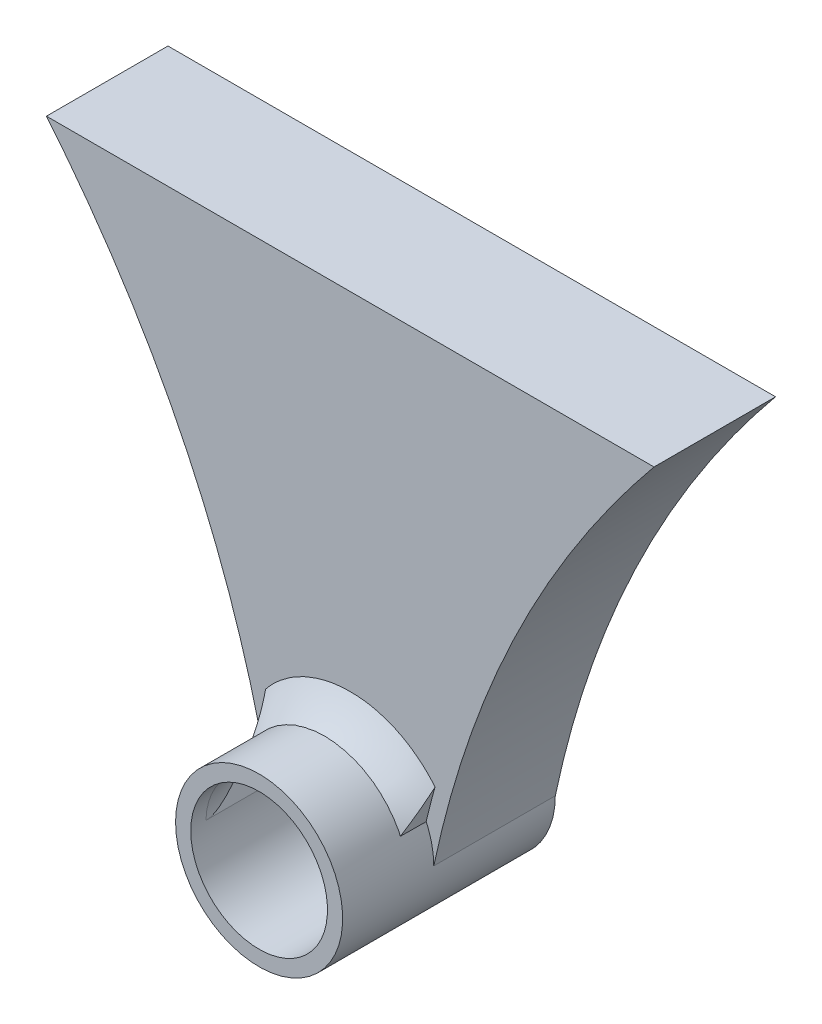
ISO-10303-21;
HEADER;
FILE_DESCRIPTION(('STEP AP214'),'2;1');
FILE_NAME('part.step','',(''),(''),'','','');
FILE_SCHEMA(('AUTOMOTIVE_DESIGN { 1 0 10303 214 1 1 1 1 }'));
ENDSEC;
DATA;
#1=APPLICATION_CONTEXT('core data for automotive mechanical design processes');
#2=APPLICATION_PROTOCOL_DEFINITION('international standard','automotive_design',2000,#1);
#3=PRODUCT_CONTEXT('',#1,'mechanical');
#4=PRODUCT('Part','Part','',(#3));
#5=PRODUCT_RELATED_PRODUCT_CATEGORY('part','',(#4));
#6=PRODUCT_DEFINITION_FORMATION('','',#4);
#7=PRODUCT_DEFINITION_CONTEXT('part definition',#1,'design');
#8=PRODUCT_DEFINITION('design','',#6,#7);
#9=PRODUCT_DEFINITION_SHAPE('','',#8);
#10=(LENGTH_UNIT() NAMED_UNIT(*) SI_UNIT(.MILLI.,.METRE.));
#11=(NAMED_UNIT(*) PLANE_ANGLE_UNIT() SI_UNIT($,.RADIAN.));
#12=(NAMED_UNIT(*) SI_UNIT($,.STERADIAN.) SOLID_ANGLE_UNIT());
#13=UNCERTAINTY_MEASURE_WITH_UNIT(LENGTH_MEASURE(1.E-05),#10,'distance_accuracy_value','');
#14=(GEOMETRIC_REPRESENTATION_CONTEXT(3) GLOBAL_UNCERTAINTY_ASSIGNED_CONTEXT((#13)) GLOBAL_UNIT_ASSIGNED_CONTEXT((#10,
#11,#12)) REPRESENTATION_CONTEXT('',''));
#15=CARTESIAN_POINT('',(0.,0.,0.));
#16=DIRECTION('',(0.,0.,1.));
#17=DIRECTION('',(1.,0.,0.));
#18=AXIS2_PLACEMENT_3D('',#15,#16,#17);
#19=CARTESIAN_POINT('',(0.,0.,0.));
#20=DIRECTION('',(0.,0.,1.));
#21=DIRECTION('',(1.,0.,0.));
#22=AXIS2_PLACEMENT_3D('',#19,#20,#21);
#23=PLANE('',#22);
#24=CARTESIAN_POINT('',(-27.5,0.,0.));
#25=CARTESIAN_POINT('',(-45.1521605662528,83.2146752013781,0.));
#26=CARTESIAN_POINT('',(-100.,150.,0.));
#27=B_SPLINE_CURVE_WITH_KNOTS('',2,(#24,#25,#26),.UNSPECIFIED.,.F.,.F.,(3,3),(0.,1.),.UNSPECIFIED.);
#28=CARTESIAN_POINT('',(-27.5,0.,0.));
#29=VERTEX_POINT('',#28);
#30=CARTESIAN_POINT('',(-100.,150.,0.));
#31=VERTEX_POINT('',#30);
#32=EDGE_CURVE('E294',#29,#31,#27,.T.);
#33=ORIENTED_EDGE('',*,*,#32,.T.);
#34=DIRECTION('',(1.,0.,0.));
#35=VECTOR('',#34,1.);
#36=CARTESIAN_POINT('',(0.,150.,0.));
#37=LINE('',#36,#35);
#38=CARTESIAN_POINT('',(100.,150.,0.));
#39=VERTEX_POINT('',#38);
#40=EDGE_CURVE('E154',#31,#39,#37,.T.);
#41=ORIENTED_EDGE('',*,*,#40,.T.);
#42=CARTESIAN_POINT('',(27.5,0.,0.));
#43=CARTESIAN_POINT('',(45.1521605662528,83.2146752013781,0.));
#44=CARTESIAN_POINT('',(100.,150.,0.));
#45=B_SPLINE_CURVE_WITH_KNOTS('',2,(#42,#43,#44),.UNSPECIFIED.,.F.,.F.,(3,3),(0.,1.),.UNSPECIFIED.);
#46=CARTESIAN_POINT('',(27.5,0.,0.));
#47=VERTEX_POINT('',#46);
#48=EDGE_CURVE('E284',#47,#39,#45,.T.);
#49=ORIENTED_EDGE('',*,*,#48,.F.);
#50=CARTESIAN_POINT('',(0.,0.,0.));
#51=DIRECTION('',(0.,0.,1.));
#52=DIRECTION('',(1.,0.,0.));
#53=AXIS2_PLACEMENT_3D('',#50,#51,#52);
#54=CIRCLE('',#53,27.5);
#55=EDGE_CURVE('E134',#29,#47,#54,.T.);
#56=ORIENTED_EDGE('',*,*,#55,.F.);
#57=EDGE_LOOP('',(#33,#41,#49,#56));
#58=FACE_BOUND('',#57,.T.);
#59=CARTESIAN_POINT('',(-22.4944780792199,0.49845355199398,0.));
#60=CARTESIAN_POINT('',(-22.5261649910723,0.647735568093537,0.));
#61=CARTESIAN_POINT('',(-22.5578084829011,0.797026858008572,0.));
#62=CARTESIAN_POINT('',(-22.6211542615998,1.09559702159194,0.));
#63=CARTESIAN_POINT('',(-22.6528565484953,1.24487589525485,0.));
#64=CARTESIAN_POINT('',(-22.7482699820461,1.69264710399708,0.));
#65=CARTESIAN_POINT('',(-22.812287732486,1.99107417391221,0.));
#66=CARTESIAN_POINT('',(-22.941045617088,2.58777257342693,0.));
#67=CARTESIAN_POINT('',(-23.0057857516789,2.88604390293397,0.));
#68=CARTESIAN_POINT('',(-23.1360145144982,3.48242312309974,0.));
#69=CARTESIAN_POINT('',(-23.2015031431676,3.78053101366205,0.));
#70=CARTESIAN_POINT('',(-23.5308047703964,5.27065922794665,0.));
#71=CARTESIAN_POINT('',(-23.8001948210256,6.46145319426544,0.));
#72=CARTESIAN_POINT('',(-24.3509328075913,8.84031195643326,0.));
#73=CARTESIAN_POINT('',(-24.6322811357418,10.0283766614174,0.));
#74=CARTESIAN_POINT('',(-25.2069607360962,12.4015996079948,0.));
#75=CARTESIAN_POINT('',(-25.5002920007143,13.5867578514275,0.));
#76=CARTESIAN_POINT('',(-26.3983181532512,17.1376888025768,0.));
#77=CARTESIAN_POINT('',(-27.0210480797167,19.4989293121634,0.));
#78=CARTESIAN_POINT('',(-28.3146535548065,24.2076504551079,0.));
#79=CARTESIAN_POINT('',(-28.9855192581997,26.5551337965829,0.));
#80=CARTESIAN_POINT('',(-30.3756314874624,31.2357190412979,0.));
#81=CARTESIAN_POINT('',(-31.0948776195382,33.5688210614262,0.));
#82=CARTESIAN_POINT('',(-32.5817934291057,38.2195446552595,0.));
#83=CARTESIAN_POINT('',(-33.34946311414,40.5371662265532,0.));
#84=CARTESIAN_POINT('',(-34.9334157397631,45.1565122395279,0.));
#85=CARTESIAN_POINT('',(-35.7497131097894,47.4582317341536,0.));
#86=CARTESIAN_POINT('',(-37.4305802597761,52.0439806405096,0.));
#87=CARTESIAN_POINT('',(-38.2951500838729,54.3280100360632,0.));
#88=CARTESIAN_POINT('',(-40.0723287613082,58.8772715684135,0.));
#89=CARTESIAN_POINT('',(-40.9849370281849,61.1425039342969,0.));
#90=CARTESIAN_POINT('',(-42.8580374444006,65.6534952965617,0.));
#91=CARTESIAN_POINT('',(-43.8185369907658,67.8992512214413,0.));
#92=CARTESIAN_POINT('',(-45.7869084961878,72.369943869366,0.));
#93=CARTESIAN_POINT('',(-46.7947810784447,74.5948803180655,0.));
#94=CARTESIAN_POINT('',(-48.8574505253708,79.0230147538254,0.));
#95=CARTESIAN_POINT('',(-49.9122496680692,81.2262116791932,0.));
#96=CARTESIAN_POINT('',(-52.328222600397,86.138576693915,0.));
#97=CARTESIAN_POINT('',(-53.7019234204557,88.8415948628368,0.));
#98=CARTESIAN_POINT('',(-56.5196053906015,94.2111016955475,0.));
#99=CARTESIAN_POINT('',(-57.9635941668755,96.8775863550787,0.));
#100=CARTESIAN_POINT('',(-60.9204523108314,102.172422027144,0.));
#101=CARTESIAN_POINT('',(-62.4333282689631,104.80076935922,0.));
#102=CARTESIAN_POINT('',(-65.5263688497674,110.017804830714,0.));
#103=CARTESIAN_POINT('',(-67.1065381008984,112.606490225464,0.));
#104=CARTESIAN_POINT('',(-70.3342412487987,117.745716866476,0.));
#105=CARTESIAN_POINT('',(-71.9818514908304,120.296210154372,0.));
#106=CARTESIAN_POINT('',(-75.3407971710139,125.35470561639,0.));
#107=CARTESIAN_POINT('',(-77.0521296771752,127.862709737816,0.));
#108=CARTESIAN_POINT('',(-80.5364341207133,132.835031062776,0.));
#109=CARTESIAN_POINT('',(-82.3093980884767,135.29935385301,0.));
#110=CARTESIAN_POINT('',(-85.914710930116,140.183264719251,0.));
#111=CARTESIAN_POINT('',(-87.7470454981084,142.602863354492,0.));
#112=CARTESIAN_POINT('',(-89.6082586524975,145.,0.));
#113=B_SPLINE_CURVE_WITH_KNOTS('',3,(#59,#60,#61,#62,#63,#64,#65,#66,#67,#68,#69,#70,#71,#72,
#73,#74,#75,#76,#77,#78,#79,#80,#81,#82,#83,#84,#85,#86,#87,#88,#89,#90,#91,#92,#93,#94,#95,#96,
#97,#98,#99,#100,#101,#102,#103,#104,#105,#106,#107,#108,#109,#110,#111,#112),.UNSPECIFIED.,.F.,
.F.,(4,2,2,2,2,2,2,2,2,2,2,2,2,2,2,2,2,2,2,2,2,2,2,2,2,2,4),(0.,0.457823908065395,
0.915648015457249,1.8312957793508,2.7469440868415,3.66259293397137,7.32518079229947,
10.9878888709575,14.6505946309336,21.9759704963478,29.2998523470201,36.6236745919939,
43.9474979777352,51.2735055144311,58.599519749545,65.9254445681241,73.2525044356426,
80.5796607188465,87.9071730845616,97.0022631156119,106.098342165854,115.195293275664,
124.292871091007,133.401049026709,142.508808393291,151.61539437759,160.719802131418),.UNSPECIFIED.);
#114=CARTESIAN_POINT('',(-22.4944780792199,0.49845355199398,0.));
#115=VERTEX_POINT('',#114);
#116=CARTESIAN_POINT('',(-89.6082586524975,145.,0.));
#117=VERTEX_POINT('',#116);
#118=EDGE_CURVE('E141',#115,#117,#113,.T.);
#119=ORIENTED_EDGE('',*,*,#118,.F.);
#120=CARTESIAN_POINT('',(0.,0.,0.));
#121=DIRECTION('',(0.,0.,1.));
#122=DIRECTION('',(1.,0.,0.));
#123=AXIS2_PLACEMENT_3D('',#120,#121,#122);
#124=CIRCLE('',#123,22.5);
#125=CARTESIAN_POINT('',(22.4944780792199,0.498453551993978,0.));
#126=VERTEX_POINT('',#125);
#127=EDGE_CURVE('E145',#115,#126,#124,.T.);
#128=ORIENTED_EDGE('',*,*,#127,.T.);
#129=CARTESIAN_POINT('',(22.4944780792199,0.498453551993978,0.));
#130=CARTESIAN_POINT('',(22.5261649910723,0.647735568093535,0.));
#131=CARTESIAN_POINT('',(22.5578084829011,0.79702685800857,0.));
#132=CARTESIAN_POINT('',(22.6211542615998,1.09559702159194,0.));
#133=CARTESIAN_POINT('',(22.6528565484953,1.24487589525484,0.));
#134=CARTESIAN_POINT('',(22.7482699820461,1.69264710399708,0.));
#135=CARTESIAN_POINT('',(22.812287732486,1.9910741739122,0.));
#136=CARTESIAN_POINT('',(22.941045617088,2.58777257342693,0.));
#137=CARTESIAN_POINT('',(23.0057857516789,2.88604390293396,0.));
#138=CARTESIAN_POINT('',(23.1360145144982,3.48242312309974,0.));
#139=CARTESIAN_POINT('',(23.2015031431676,3.78053101366205,0.));
#140=CARTESIAN_POINT('',(23.5308047703964,5.27065922794664,0.));
#141=CARTESIAN_POINT('',(23.8001948210256,6.46145319426543,0.));
#142=CARTESIAN_POINT('',(24.3509328075913,8.84031195643325,0.));
#143=CARTESIAN_POINT('',(24.6322811357418,10.0283766614174,0.));
#144=CARTESIAN_POINT('',(25.2069607360962,12.4015996079947,0.));
#145=CARTESIAN_POINT('',(25.5002920007143,13.5867578514275,0.));
#146=CARTESIAN_POINT('',(26.3983181532512,17.1376888025768,0.));
#147=CARTESIAN_POINT('',(27.0210480797167,19.4989293121634,0.));
#148=CARTESIAN_POINT('',(28.3146535548065,24.2076504551079,0.));
#149=CARTESIAN_POINT('',(28.9855192581997,26.5551337965829,0.));
#150=CARTESIAN_POINT('',(30.3756314874624,31.2357190412978,0.));
#151=CARTESIAN_POINT('',(31.0948776195381,33.5688210614262,0.));
#152=CARTESIAN_POINT('',(32.5817934291057,38.2195446552595,0.));
#153=CARTESIAN_POINT('',(33.3494631141399,40.5371662265532,0.));
#154=CARTESIAN_POINT('',(34.933415739763,45.1565122395278,0.));
#155=CARTESIAN_POINT('',(35.7497131097894,47.4582317341536,0.));
#156=CARTESIAN_POINT('',(37.4305802597761,52.0439806405095,0.));
#157=CARTESIAN_POINT('',(38.2951500838729,54.3280100360632,0.));
#158=CARTESIAN_POINT('',(40.0723287613081,58.8772715684135,0.));
#159=CARTESIAN_POINT('',(40.9849370281849,61.1425039342969,0.));
#160=CARTESIAN_POINT('',(42.8580374444006,65.6534952965617,0.));
#161=CARTESIAN_POINT('',(43.8185369907658,67.8992512214413,0.));
#162=CARTESIAN_POINT('',(45.7869084961877,72.369943869366,0.));
#163=CARTESIAN_POINT('',(46.7947810784446,74.5948803180655,0.));
#164=CARTESIAN_POINT('',(48.8574505253708,79.0230147538254,0.));
#165=CARTESIAN_POINT('',(49.9122496680692,81.2262116791932,0.));
#166=CARTESIAN_POINT('',(52.328222600397,86.138576693915,0.));
#167=CARTESIAN_POINT('',(53.7019234204556,88.8415948628367,0.));
#168=CARTESIAN_POINT('',(56.5196053906014,94.2111016955475,0.));
#169=CARTESIAN_POINT('',(57.9635941668755,96.8775863550786,0.));
#170=CARTESIAN_POINT('',(60.9204523108314,102.172422027144,0.));
#171=CARTESIAN_POINT('',(62.4333282689631,104.80076935922,0.));
#172=CARTESIAN_POINT('',(65.5263688497673,110.017804830714,0.));
#173=CARTESIAN_POINT('',(67.1065381008983,112.606490225464,0.));
#174=CARTESIAN_POINT('',(70.3342412487987,117.745716866476,0.));
#175=CARTESIAN_POINT('',(71.9818514908303,120.296210154372,0.));
#176=CARTESIAN_POINT('',(75.3407971710138,125.35470561639,0.));
#177=CARTESIAN_POINT('',(77.0521296771752,127.862709737816,0.));
#178=CARTESIAN_POINT('',(80.5364341207132,132.835031062776,0.));
#179=CARTESIAN_POINT('',(82.3093980884767,135.29935385301,0.));
#180=CARTESIAN_POINT('',(85.914710930116,140.183264719251,0.));
#181=CARTESIAN_POINT('',(87.7470454981084,142.602863354492,0.));
#182=CARTESIAN_POINT('',(89.6082586524975,145.,0.));
#183=B_SPLINE_CURVE_WITH_KNOTS('',3,(#129,#130,#131,#132,#133,#134,#135,#136,#137,#138,#139,
#140,#141,#142,#143,#144,#145,#146,#147,#148,#149,#150,#151,#152,#153,#154,#155,#156,#157,#158,
#159,#160,#161,#162,#163,#164,#165,#166,#167,#168,#169,#170,#171,#172,#173,#174,#175,#176,#177,
#178,#179,#180,#181,#182),.UNSPECIFIED.,.F.,.F.,(4,2,2,2,2,2,2,2,2,2,2,2,2,2,2,2,2,2,2,2,2,2,2,
2,2,2,4),(0.,0.457823908065394,0.915648015457248,1.83129577935079,2.7469440868415,
3.66259293397137,7.32518079229946,10.9878888709575,14.6505946309336,21.9759704963478,
29.2998523470201,36.6236745919939,43.9474979777352,51.2735055144311,58.599519749545,
65.9254445681241,73.2525044356425,80.5796607188465,87.9071730845615,97.0022631156118,
106.098342165854,115.195293275664,124.292871091007,133.401049026709,142.508808393291,
151.61539437759,160.719802131418),.UNSPECIFIED.);
#184=CARTESIAN_POINT('',(89.6082586524975,145.,0.));
#185=VERTEX_POINT('',#184);
#186=EDGE_CURVE('E202',#126,#185,#183,.T.);
#187=ORIENTED_EDGE('',*,*,#186,.T.);
#188=DIRECTION('',(1.,0.,0.));
#189=VECTOR('',#188,1.);
#190=CARTESIAN_POINT('',(0.,145.,0.));
#191=LINE('',#190,#189);
#192=EDGE_CURVE('E196',#117,#185,#191,.T.);
#193=ORIENTED_EDGE('',*,*,#192,.F.);
#194=EDGE_LOOP('',(#119,#128,#187,#193));
#195=FACE_BOUND('',#194,.T.);
#196=ADVANCED_FACE('F39',(#58,#195),#23,.F.);
#197=CARTESIAN_POINT('',(-27.1469567886749,-1.66429350402756,40.));
#198=CARTESIAN_POINT('',(-27.3234783943375,-0.832146752013781,40.));
#199=CARTESIAN_POINT('',(-27.5,0.,40.));
#200=CARTESIAN_POINT('',(-45.1521605662528,83.2146752013781,40.));
#201=CARTESIAN_POINT('',(-100.,150.,40.));
#202=B_SPLINE_CURVE_WITH_KNOTS('',2,(#197,#198,#199,#200,#201),.UNSPECIFIED.,.F.,.F.,(3,2,3),
(-0.01,0.,1.),.UNSPECIFIED.);
#203=DIRECTION('',(0.,0.,-1.));
#204=VECTOR('',#203,1.);
#205=SURFACE_OF_LINEAR_EXTRUSION('',#202,#204);
#206=ORIENTED_EDGE('',*,*,#32,.F.);
#207=DIRECTION('',(0.,0.,-1.));
#208=VECTOR('',#207,1.);
#209=CARTESIAN_POINT('',(-27.5,0.,40.));
#210=LINE('',#209,#208);
#211=CARTESIAN_POINT('',(-27.5,0.,40.));
#212=VERTEX_POINT('',#211);
#213=EDGE_CURVE('E136',#212,#29,#210,.T.);
#214=ORIENTED_EDGE('',*,*,#213,.F.);
#215=CARTESIAN_POINT('',(-100.,150.,40.));
#216=VERTEX_POINT('',#215);
#217=EDGE_CURVE('E126',#212,#216,#202,.T.);
#218=ORIENTED_EDGE('',*,*,#217,.T.);
#219=DIRECTION('',(0.,0.,-1.));
#220=VECTOR('',#219,1.);
#221=CARTESIAN_POINT('',(-100.,150.,40.));
#222=LINE('',#221,#220);
#223=EDGE_CURVE('E283',#216,#31,#222,.T.);
#224=ORIENTED_EDGE('',*,*,#223,.T.);
#225=EDGE_LOOP('',(#206,#214,#218,#224));
#226=FACE_BOUND('',#225,.T.);
#227=ADVANCED_FACE('F163',(#226),#205,.T.);
#228=CARTESIAN_POINT('',(0.,0.,40.));
#229=DIRECTION('',(0.,0.,-1.));
#230=DIRECTION('',(-1.,0.,0.));
#231=AXIS2_PLACEMENT_3D('',#228,#229,#230);
#232=CYLINDRICAL_SURFACE('',#231,27.5);
#233=ORIENTED_EDGE('',*,*,#55,.T.);
#234=DIRECTION('',(0.,0.,-1.));
#235=VECTOR('',#234,1.);
#236=CARTESIAN_POINT('',(27.5,0.,40.));
#237=LINE('',#236,#235);
#238=CARTESIAN_POINT('',(27.5,0.,40.));
#239=VERTEX_POINT('',#238);
#240=EDGE_CURVE('E118',#239,#47,#237,.T.);
#241=ORIENTED_EDGE('',*,*,#240,.F.);
#242=CARTESIAN_POINT('',(0.,0.,40.));
#243=DIRECTION('',(0.,0.,1.));
#244=DIRECTION('',(1.,0.,0.));
#245=AXIS2_PLACEMENT_3D('',#242,#243,#244);
#246=CIRCLE('',#245,27.5);
#247=EDGE_CURVE('E132',#239,#212,#246,.T.);
#248=ORIENTED_EDGE('',*,*,#247,.T.);
#249=ORIENTED_EDGE('',*,*,#213,.T.);
#250=EDGE_LOOP('',(#233,#241,#248,#249));
#251=FACE_BOUND('',#250,.T.);
#252=CARTESIAN_POINT('',(0.,0.,70.));
#253=DIRECTION('',(0.,0.,-1.));
#254=DIRECTION('',(-1.,0.,0.));
#255=AXIS2_PLACEMENT_3D('',#252,#253,#254);
#256=CIRCLE('',#255,27.5);
#257=CARTESIAN_POINT('',(-27.5,0.,70.));
#258=VERTEX_POINT('',#257);
#259=EDGE_CURVE('E142',#258,#258,#256,.T.);
#260=ORIENTED_EDGE('',*,*,#259,.T.);
#261=EDGE_LOOP('',(#260));
#262=FACE_BOUND('',#261,.T.);
#263=ADVANCED_FACE('F130',(#251,#262),#232,.T.);
#264=CARTESIAN_POINT('',(27.1469567886749,-1.66429350402756,40.));
#265=CARTESIAN_POINT('',(27.3234783943375,-0.832146752013781,40.));
#266=CARTESIAN_POINT('',(27.5,0.,40.));
#267=CARTESIAN_POINT('',(45.1521605662528,83.2146752013781,40.));
#268=CARTESIAN_POINT('',(100.,150.,40.));
#269=B_SPLINE_CURVE_WITH_KNOTS('',2,(#264,#265,#266,#267,#268),.UNSPECIFIED.,.F.,.F.,(3,2,3),
(-0.01,0.,1.),.UNSPECIFIED.);
#270=DIRECTION('',(0.,0.,-1.));
#271=VECTOR('',#270,1.);
#272=SURFACE_OF_LINEAR_EXTRUSION('',#269,#271);
#273=ORIENTED_EDGE('',*,*,#48,.T.);
#274=DIRECTION('',(0.,0.,-1.));
#275=VECTOR('',#274,1.);
#276=CARTESIAN_POINT('',(100.,150.,40.));
#277=LINE('',#276,#275);
#278=CARTESIAN_POINT('',(100.,150.,40.));
#279=VERTEX_POINT('',#278);
#280=EDGE_CURVE('E120',#279,#39,#277,.T.);
#281=ORIENTED_EDGE('',*,*,#280,.F.);
#282=EDGE_CURVE('E114',#239,#279,#269,.T.);
#283=ORIENTED_EDGE('',*,*,#282,.F.);
#284=ORIENTED_EDGE('',*,*,#240,.T.);
#285=EDGE_LOOP('',(#273,#281,#283,#284));
#286=FACE_BOUND('',#285,.T.);
#287=ADVANCED_FACE('F117',(#286),#272,.F.);
#288=CARTESIAN_POINT('',(0.,150.,40.));
#289=DIRECTION('',(0.,1.,0.));
#290=DIRECTION('',(0.,0.,1.));
#291=AXIS2_PLACEMENT_3D('',#288,#289,#290);
#292=PLANE('',#291);
#293=ORIENTED_EDGE('',*,*,#40,.F.);
#294=ORIENTED_EDGE('',*,*,#223,.F.);
#295=DIRECTION('',(1.,0.,0.));
#296=VECTOR('',#295,1.);
#297=CARTESIAN_POINT('',(0.,150.,40.));
#298=LINE('',#297,#296);
#299=EDGE_CURVE('E125',#216,#279,#298,.T.);
#300=ORIENTED_EDGE('',*,*,#299,.T.);
#301=ORIENTED_EDGE('',*,*,#280,.T.);
#302=EDGE_LOOP('',(#293,#294,#300,#301));
#303=FACE_BOUND('',#302,.T.);
#304=ADVANCED_FACE('F267',(#303),#292,.T.);
#305=CARTESIAN_POINT('',(0.,0.,40.));
#306=DIRECTION('',(0.,0.,1.));
#307=DIRECTION('',(1.,0.,0.));
#308=AXIS2_PLACEMENT_3D('',#305,#306,#307);
#309=PLANE('',#308);
#310=ORIENTED_EDGE('',*,*,#247,.F.);
#311=ORIENTED_EDGE('',*,*,#282,.T.);
#312=ORIENTED_EDGE('',*,*,#299,.F.);
#313=ORIENTED_EDGE('',*,*,#217,.F.);
#314=EDGE_LOOP('',(#310,#311,#312,#313));
#315=FACE_BOUND('',#314,.T.);
#316=ADVANCED_FACE('F139',(#315),#309,.T.);
#317=CARTESIAN_POINT('',(-27.1469567886749,-1.66429350402756,40.));
#318=CARTESIAN_POINT('',(-27.3234783943375,-0.832146752013781,40.));
#319=CARTESIAN_POINT('',(-45.1521605662528,83.2146752013781,40.));
#320=CARTESIAN_POINT('',(-100.,150.,40.));
#321=B_SPLINE_CURVE_WITH_KNOTS('',2,(#317,#318,#319,#320),.UNSPECIFIED.,.F.,.F.,(3,1,3),(-0.01,
0.,1.),.UNSPECIFIED.);
#322=DIRECTION('',(0.,0.,-1.));
#323=VECTOR('',#322,1.);
#324=SURFACE_OF_LINEAR_EXTRUSION('',#321,#323);
#325=OFFSET_SURFACE('',#324,-5.,.F.);
#326=ORIENTED_EDGE('',*,*,#118,.T.);
#327=DIRECTION('',(0.,0.,-1.));
#328=VECTOR('',#327,1.);
#329=CARTESIAN_POINT('',(-89.6082586524975,145.,35.));
#330=LINE('',#329,#328);
#331=CARTESIAN_POINT('',(-89.6082586524975,145.,35.));
#332=VERTEX_POINT('',#331);
#333=EDGE_CURVE('E226',#332,#117,#330,.T.);
#334=ORIENTED_EDGE('',*,*,#333,.F.);
#335=CARTESIAN_POINT('',(-22.4944780792199,0.49845355199398,35.));
#336=CARTESIAN_POINT('',(-22.5261649910723,0.647735568093537,35.));
#337=CARTESIAN_POINT('',(-22.5578084829011,0.797026858008572,35.));
#338=CARTESIAN_POINT('',(-22.6211542615998,1.09559702159194,35.));
#339=CARTESIAN_POINT('',(-22.6528565484953,1.24487589525485,35.));
#340=CARTESIAN_POINT('',(-22.7482699820461,1.69264710399708,35.));
#341=CARTESIAN_POINT('',(-22.812287732486,1.99107417391221,35.));
#342=CARTESIAN_POINT('',(-22.941045617088,2.58777257342693,35.));
#343=CARTESIAN_POINT('',(-23.0057857516789,2.88604390293397,35.));
#344=CARTESIAN_POINT('',(-23.1360145144982,3.48242312309974,35.));
#345=CARTESIAN_POINT('',(-23.2015031431676,3.78053101366205,35.));
#346=CARTESIAN_POINT('',(-23.5308047703964,5.27065922794665,35.));
#347=CARTESIAN_POINT('',(-23.8001948210256,6.46145319426544,35.));
#348=CARTESIAN_POINT('',(-24.3509328075913,8.84031195643326,35.));
#349=CARTESIAN_POINT('',(-24.6322811357418,10.0283766614174,35.));
#350=CARTESIAN_POINT('',(-25.2069607360962,12.4015996079948,35.));
#351=CARTESIAN_POINT('',(-25.5002920007143,13.5867578514275,35.));
#352=CARTESIAN_POINT('',(-26.3983181532512,17.1376888025768,35.));
#353=CARTESIAN_POINT('',(-27.0210480797167,19.4989293121634,35.));
#354=CARTESIAN_POINT('',(-28.3146535548065,24.2076504551079,35.));
#355=CARTESIAN_POINT('',(-28.9855192581997,26.5551337965829,35.));
#356=CARTESIAN_POINT('',(-30.3756314874624,31.2357190412979,35.));
#357=CARTESIAN_POINT('',(-31.0948776195382,33.5688210614262,35.));
#358=CARTESIAN_POINT('',(-32.5817934291057,38.2195446552595,35.));
#359=CARTESIAN_POINT('',(-33.34946311414,40.5371662265532,35.));
#360=CARTESIAN_POINT('',(-34.9334157397631,45.1565122395279,35.));
#361=CARTESIAN_POINT('',(-35.7497131097894,47.4582317341536,35.));
#362=CARTESIAN_POINT('',(-37.4305802597761,52.0439806405096,35.));
#363=CARTESIAN_POINT('',(-38.2951500838729,54.3280100360632,35.));
#364=CARTESIAN_POINT('',(-40.0723287613082,58.8772715684135,35.));
#365=CARTESIAN_POINT('',(-40.9849370281849,61.1425039342969,35.));
#366=CARTESIAN_POINT('',(-42.8580374444006,65.6534952965617,35.));
#367=CARTESIAN_POINT('',(-43.8185369907658,67.8992512214413,35.));
#368=CARTESIAN_POINT('',(-45.7869084961878,72.369943869366,35.));
#369=CARTESIAN_POINT('',(-46.7947810784447,74.5948803180655,35.));
#370=CARTESIAN_POINT('',(-48.8574505253708,79.0230147538254,35.));
#371=CARTESIAN_POINT('',(-49.9122496680692,81.2262116791932,35.));
#372=CARTESIAN_POINT('',(-52.328222600397,86.138576693915,35.));
#373=CARTESIAN_POINT('',(-53.7019234204557,88.8415948628368,35.));
#374=CARTESIAN_POINT('',(-56.5196053906015,94.2111016955475,35.));
#375=CARTESIAN_POINT('',(-57.9635941668755,96.8775863550787,35.));
#376=CARTESIAN_POINT('',(-60.9204523108314,102.172422027144,35.));
#377=CARTESIAN_POINT('',(-62.4333282689631,104.80076935922,35.));
#378=CARTESIAN_POINT('',(-65.5263688497674,110.017804830714,35.));
#379=CARTESIAN_POINT('',(-67.1065381008984,112.606490225464,35.));
#380=CARTESIAN_POINT('',(-70.3342412487987,117.745716866476,35.));
#381=CARTESIAN_POINT('',(-71.9818514908304,120.296210154372,35.));
#382=CARTESIAN_POINT('',(-75.3407971710139,125.35470561639,35.));
#383=CARTESIAN_POINT('',(-77.0521296771752,127.862709737816,35.));
#384=CARTESIAN_POINT('',(-80.5364341207133,132.835031062776,35.));
#385=CARTESIAN_POINT('',(-82.3093980884767,135.29935385301,35.));
#386=CARTESIAN_POINT('',(-85.914710930116,140.183264719251,35.));
#387=CARTESIAN_POINT('',(-87.7470454981084,142.602863354492,35.));
#388=CARTESIAN_POINT('',(-89.6082586524975,145.,35.));
#389=B_SPLINE_CURVE_WITH_KNOTS('',3,(#335,#336,#337,#338,#339,#340,#341,#342,#343,#344,#345,
#346,#347,#348,#349,#350,#351,#352,#353,#354,#355,#356,#357,#358,#359,#360,#361,#362,#363,#364,
#365,#366,#367,#368,#369,#370,#371,#372,#373,#374,#375,#376,#377,#378,#379,#380,#381,#382,#383,
#384,#385,#386,#387,#388),.UNSPECIFIED.,.F.,.F.,(4,2,2,2,2,2,2,2,2,2,2,2,2,2,2,2,2,2,2,2,2,2,2,
2,2,2,4),(0.,0.457823908065395,0.915648015457249,1.8312957793508,2.7469440868415,
3.66259293397137,7.32518079229947,10.9878888709575,14.6505946309336,21.9759704963478,
29.2998523470201,36.6236745919939,43.9474979777352,51.2735055144311,58.599519749545,
65.9254445681241,73.2525044356426,80.5796607188465,87.9071730845616,97.0022631156119,
106.098342165854,115.195293275664,124.292871091007,133.401049026709,142.508808393291,
151.61539437759,160.719802131418),.UNSPECIFIED.);
#390=CARTESIAN_POINT('',(-33.3591010922747,40.5391215286591,35.));
#391=VERTEX_POINT('',#390);
#392=EDGE_CURVE('E182',#391,#332,#389,.T.);
#393=ORIENTED_EDGE('',*,*,#392,.F.);
#394=CARTESIAN_POINT('',(-33.3591010922747,40.5391215286591,35.));
#395=CARTESIAN_POINT('',(-33.2396863522467,40.1828038016042,34.999999228548));
#396=CARTESIAN_POINT('',(-33.120855722529,39.8263224906805,35.0061611829986));
#397=CARTESIAN_POINT('',(-32.8844688573813,39.1133699155875,35.0306395846948));
#398=CARTESIAN_POINT('',(-32.7669125700805,38.756898651603,35.048955535322));
#399=CARTESIAN_POINT('',(-32.4166432098861,37.6890086749979,35.121807324912));
#400=CARTESIAN_POINT('',(-32.185978279367,36.9780652324389,35.1942481538338));
#401=CARTESIAN_POINT('',(-31.7310852486079,35.5607423609773,35.38522615853));
#402=CARTESIAN_POINT('',(-31.5068545350462,34.8543611720601,35.5037443266071));
#403=CARTESIAN_POINT('',(-31.0680844229734,33.4570153895682,35.7832519901115));
#404=CARTESIAN_POINT('',(-30.8534592437598,32.7659682875556,35.9436956698808));
#405=CARTESIAN_POINT('',(-30.4313924487371,31.3923100741296,36.3057811573912));
#406=CARTESIAN_POINT('',(-30.223953068774,30.7097016301278,36.5074356554978));
#407=CARTESIAN_POINT('',(-29.8166375207765,29.3549003651842,36.9498140306834));
#408=CARTESIAN_POINT('',(-29.6167624205155,28.6827090225695,37.1905433983894));
#409=CARTESIAN_POINT('',(-29.1870394703883,27.2219791770651,37.7588043665729));
#410=CARTESIAN_POINT('',(-28.9588377028955,26.4359806797616,38.0941237078554));
#411=CARTESIAN_POINT('',(-28.513681823516,24.88324016465,38.813355227498));
#412=CARTESIAN_POINT('',(-28.2967290523235,24.1165004477587,39.1972731793288));
#413=CARTESIAN_POINT('',(-27.8740446729054,22.6038981769031,40.0098284091614));
#414=CARTESIAN_POINT('',(-27.6683137979525,21.8580369887516,40.4384686041322));
#415=CARTESIAN_POINT('',(-27.2668531676713,20.3845109078282,41.3389752132168));
#416=CARTESIAN_POINT('',(-27.0711812626294,19.6569614058097,41.8110557115608));
#417=CARTESIAN_POINT('',(-26.6907005901267,18.2248709426944,42.7927288528061));
#418=CARTESIAN_POINT('',(-26.5058906942848,17.5203275950343,43.3023175867975));
#419=CARTESIAN_POINT('',(-26.14672349976,16.134542404232,44.3554517695092));
#420=CARTESIAN_POINT('',(-25.9723646654594,15.4532971441535,44.89899220548));
#421=CARTESIAN_POINT('',(-25.6747592961552,14.2767072452165,45.8810557558512));
#422=CARTESIAN_POINT('',(-25.5493845157971,13.776399754075,46.3130199394589));
#423=CARTESIAN_POINT('',(-25.3041396187651,12.7890417227135,47.1933212188976));
#424=CARTESIAN_POINT('',(-25.1842693377941,12.3019907869914,47.6416578253298));
#425=CARTESIAN_POINT('',(-24.9498065790466,11.3409802484941,48.5537098292009));
#426=CARTESIAN_POINT('',(-24.8352154118313,10.86702390807,49.0174289967997));
#427=CARTESIAN_POINT('',(-24.6111246193954,9.93216771171745,49.9594334761108));
#428=CARTESIAN_POINT('',(-24.5016271434401,9.47127339875022,50.4377247981247));
#429=CARTESIAN_POINT('',(-24.2879229411555,8.56411689022422,51.406857066622));
#430=CARTESIAN_POINT('',(-24.1837038180471,8.11782137389236,51.8976641080097));
#431=CARTESIAN_POINT('',(-23.9802517151141,7.23934266046894,52.8926604637451));
#432=CARTESIAN_POINT('',(-23.8810180378038,6.80715749225691,53.39684789095));
#433=CARTESIAN_POINT('',(-23.7360353330465,6.17060369598705,54.1633620284654));
#434=CARTESIAN_POINT('',(-23.6883627300579,5.96041923547201,54.420513010742));
#435=CARTESIAN_POINT('',(-23.5943439826538,5.54422745198776,54.9384096237403));
#436=CARTESIAN_POINT('',(-23.5479978090125,5.33822003701276,55.199155175073));
#437=CARTESIAN_POINT('',(-23.4567215868212,4.93089063109172,55.7243257096206));
#438=CARTESIAN_POINT('',(-23.4117908768065,4.72956646346403,55.9887488883862));
#439=CARTESIAN_POINT('',(-23.323428812593,4.33209748936364,56.5216973646238));
#440=CARTESIAN_POINT('',(-23.279997392674,4.13595245595679,56.7902224815445));
#441=CARTESIAN_POINT('',(-23.2036403150696,3.78980165373759,57.2755726218964));
#442=CARTESIAN_POINT('',(-23.1704064646116,3.63867550560402,57.4915497593419));
#443=CARTESIAN_POINT('',(-23.105088600275,3.34077912450292,57.9266649182934));
#444=CARTESIAN_POINT('',(-23.0730045826702,3.19400887741909,58.1458029295526));
#445=CARTESIAN_POINT('',(-23.0101292030383,2.90556198895967,58.5876690419815));
#446=CARTESIAN_POINT('',(-22.9793381334939,2.76388650111841,58.8103979398567));
#447=CARTESIAN_POINT('',(-22.9192370887804,2.48659244015513,59.2600581278988));
#448=CARTESIAN_POINT('',(-22.8899283323979,2.35097886156302,59.4869926731061));
#449=CARTESIAN_POINT('',(-22.8331044535569,2.08736701828562,59.9454405811132));
#450=CARTESIAN_POINT('',(-22.8055890714464,1.95936765141923,60.1769532747153));
#451=CARTESIAN_POINT('',(-22.7527399502191,1.71292087453947,60.6452074373865));
#452=CARTESIAN_POINT('',(-22.7274056035998,1.59447080526643,60.881947427217));
#453=CARTESIAN_POINT('',(-22.6804242909378,1.37433496821682,61.3515452588956));
#454=CARTESIAN_POINT('',(-22.6586683449323,1.27215929548079,61.5841605731754));
#455=CARTESIAN_POINT('',(-22.6182437662282,1.08194530435871,62.0554862779053));
#456=CARTESIAN_POINT('',(-22.5995756129582,0.993909181423006,62.2941976082288));
#457=CARTESIAN_POINT('',(-22.5661746983595,0.836429564323437,62.7765491312255));
#458=CARTESIAN_POINT('',(-22.5514204294693,0.766884453323998,63.0201541244192));
#459=CARTESIAN_POINT('',(-22.5265814284976,0.649796133148728,63.5127346163833));
#460=CARTESIAN_POINT('',(-22.5164923749295,0.602232562034629,63.7617049204538));
#461=CARTESIAN_POINT('',(-22.5042997281922,0.544753719323277,64.1757141884701));
#462=CARTESIAN_POINT('',(-22.5006378198947,0.527491320260404,64.3396968185317));
#463=CARTESIAN_POINT('',(-22.4969529704633,0.510120566287745,64.5865904720534));
#464=CARTESIAN_POINT('',(-22.4960259922168,0.505750644389368,64.6692007602657));
#465=CARTESIAN_POINT('',(-22.4947880707989,0.499914873346809,64.8345388043466));
#466=CARTESIAN_POINT('',(-22.4944772060901,0.498449394085718,64.9172665738343));
#467=CARTESIAN_POINT('',(-22.4944780792199,0.498453551993906,65.));
#468=B_SPLINE_CURVE_WITH_KNOTS('',3,(#394,#395,#396,#397,#398,#399,#400,#401,#402,#403,#404,
#405,#406,#407,#408,#409,#410,#411,#412,#413,#414,#415,#416,#417,#418,#419,#420,#421,#422,#423,
#424,#425,#426,#427,#428,#429,#430,#431,#432,#433,#434,#435,#436,#437,#438,#439,#440,#441,#442,
#443,#444,#445,#446,#447,#448,#449,#450,#451,#452,#453,#454,#455,#456,#457,#458,#459,#460,#461,
#462,#463,#464,#465,#466,#467),.UNSPECIFIED.,.F.,.F.,(4,2,2,2,2,2,2,2,2,2,2,2,2,2,2,2,2,2,2,2,2,
2,2,2,2,2,2,2,2,2,2,2,2,2,2,2,4),(0.,1.12727734852788,2.25450863876827,4.50565994344865,
6.75588359303597,8.97815750348548,11.2011167698402,13.4243886673907,16.0760761378663,
18.7280789225641,21.3802547900712,24.0462834427644,26.7120346483644,29.377393199061,
31.395360801429,33.4132681326887,35.4316737474091,37.4509234366376,39.4651869987984,
41.4791679674162,42.4857039203236,43.4922176786069,44.4982538840967,45.5042459346972,
46.3012596113749,47.0982707048614,47.8954611324549,48.6932967105533,49.4910165169949,
50.2885134039107,51.0531217868896,51.8178487762108,52.5782820473052,53.3380094950167,
53.8323931684758,54.0805374322616,54.3287132953877),.UNSPECIFIED.);
#469=CARTESIAN_POINT('',(-22.4944780792199,0.49845355199398,65.));
#470=VERTEX_POINT('',#469);
#471=EDGE_CURVE('E53',#391,#470,#468,.T.);
#472=ORIENTED_EDGE('',*,*,#471,.T.);
#473=DIRECTION('',(0.,0.,-1.));
#474=VECTOR('',#473,1.);
#475=CARTESIAN_POINT('',(-22.4944780792199,0.49845355199398,35.));
#476=LINE('',#475,#474);
#477=EDGE_CURVE('E60',#470,#115,#476,.T.);
#478=ORIENTED_EDGE('',*,*,#477,.T.);
#479=EDGE_LOOP('',(#326,#334,#393,#472,#478));
#480=FACE_BOUND('',#479,.T.);
#481=ADVANCED_FACE('F171',(#480),#325,.F.);
#482=CARTESIAN_POINT('',(0.,0.,40.));
#483=DIRECTION('',(0.,0.,-1.));
#484=DIRECTION('',(-1.,0.,0.));
#485=AXIS2_PLACEMENT_3D('',#482,#483,#484);
#486=CYLINDRICAL_SURFACE('',#485,22.5);
#487=ORIENTED_EDGE('',*,*,#477,.F.);
#488=CARTESIAN_POINT('',(0.,0.,65.));
#489=DIRECTION('',(0.,0.,1.));
#490=DIRECTION('',(1.,0.,0.));
#491=AXIS2_PLACEMENT_3D('',#488,#489,#490);
#492=CIRCLE('',#491,22.5);
#493=CARTESIAN_POINT('',(22.4944780792199,0.498453551993978,65.));
#494=VERTEX_POINT('',#493);
#495=EDGE_CURVE('E242',#470,#494,#492,.F.);
#496=ORIENTED_EDGE('',*,*,#495,.T.);
#497=DIRECTION('',(0.,0.,-1.));
#498=VECTOR('',#497,1.);
#499=CARTESIAN_POINT('',(22.4944780792199,0.498453551993978,35.));
#500=LINE('',#499,#498);
#501=EDGE_CURVE('E67',#494,#126,#500,.T.);
#502=ORIENTED_EDGE('',*,*,#501,.T.);
#503=ORIENTED_EDGE('',*,*,#127,.F.);
#504=EDGE_LOOP('',(#487,#496,#502,#503));
#505=FACE_BOUND('',#504,.T.);
#506=CARTESIAN_POINT('',(0.,0.,70.));
#507=DIRECTION('',(0.,0.,-1.));
#508=DIRECTION('',(-1.,0.,0.));
#509=AXIS2_PLACEMENT_3D('',#506,#507,#508);
#510=CIRCLE('',#509,22.5);
#511=CARTESIAN_POINT('',(-22.5,0.,70.));
#512=VERTEX_POINT('',#511);
#513=EDGE_CURVE('E148',#512,#512,#510,.T.);
#514=ORIENTED_EDGE('',*,*,#513,.F.);
#515=EDGE_LOOP('',(#514));
#516=FACE_BOUND('',#515,.T.);
#517=ADVANCED_FACE('F175',(#505,#516),#486,.F.);
#518=CARTESIAN_POINT('',(27.1469567886749,-1.66429350402756,40.));
#519=CARTESIAN_POINT('',(27.3234783943375,-0.832146752013781,40.));
#520=CARTESIAN_POINT('',(45.1521605662528,83.2146752013781,40.));
#521=CARTESIAN_POINT('',(100.,150.,40.));
#522=B_SPLINE_CURVE_WITH_KNOTS('',2,(#518,#519,#520,#521),.UNSPECIFIED.,.F.,.F.,(3,1,3),(-0.01,
0.,1.),.UNSPECIFIED.);
#523=DIRECTION('',(0.,0.,-1.));
#524=VECTOR('',#523,1.);
#525=SURFACE_OF_LINEAR_EXTRUSION('',#522,#524);
#526=OFFSET_SURFACE('',#525,5.,.F.);
#527=ORIENTED_EDGE('',*,*,#186,.F.);
#528=ORIENTED_EDGE('',*,*,#501,.F.);
#529=CARTESIAN_POINT('',(22.4944780792199,0.498453551993978,65.));
#530=CARTESIAN_POINT('',(22.4944726452377,0.49842792852742,64.874826643421));
#531=CARTESIAN_POINT('',(22.4951874191959,0.50179747323007,64.7496625493972));
#532=CARTESIAN_POINT('',(22.498012291753,0.515114311896013,64.5001446115774));
#533=CARTESIAN_POINT('',(22.5001174295386,0.525038219914233,64.3757894686844));
#534=CARTESIAN_POINT('',(22.5056732682207,0.551229182015979,64.128020430713));
#535=CARTESIAN_POINT('',(22.5091214372454,0.567484300552268,64.0046052074408));
#536=CARTESIAN_POINT('',(22.5172894281333,0.605989363702693,63.7588281246471));
#537=CARTESIAN_POINT('',(22.5220085792277,0.628236146179254,63.6364657445324));
#538=CARTESIAN_POINT('',(22.5325240407652,0.677807279147061,63.3954327342464));
#539=CARTESIAN_POINT('',(22.5382964149859,0.705018797281063,63.2767377129114));
#540=CARTESIAN_POINT('',(22.5508914064466,0.764393938702034,63.0405753981216));
#541=CARTESIAN_POINT('',(22.5577146843098,0.796560676961653,62.923108926911));
#542=CARTESIAN_POINT('',(22.5723189040753,0.86540453451541,62.6894986334643));
#543=CARTESIAN_POINT('',(22.5801003774099,0.902084156725561,62.5733555845868));
#544=CARTESIAN_POINT('',(22.5965249564893,0.979520853201334,62.3424961644324));
#545=CARTESIAN_POINT('',(22.6051681391263,1.02027829134067,62.2277799215016));
#546=CARTESIAN_POINT('',(22.6361240879745,1.16613625499541,61.837000222017));
#547=CARTESIAN_POINT('',(22.6603391650992,1.28004075243898,61.5643519987925));
#548=CARTESIAN_POINT('',(22.7123205504141,1.52388222961717,61.0265368112876));
#549=CARTESIAN_POINT('',(22.7400899926168,1.65383335463596,60.761376704484));
#550=CARTESIAN_POINT('',(22.798441549538,1.92610673549591,60.2373691696055));
#551=CARTESIAN_POINT('',(22.8290275667848,2.06844614057547,59.9785311485789));
#552=CARTESIAN_POINT('',(22.8924378594673,2.36262841530511,59.4665522650832));
#553=CARTESIAN_POINT('',(22.9252626629697,2.51447352638551,59.2134127655934));
#554=CARTESIAN_POINT('',(22.9934889556401,2.82906617983333,58.706656318816));
#555=CARTESIAN_POINT('',(23.0289308298532,2.99197853239393,58.4531475557016));
#556=CARTESIAN_POINT('',(23.1014095561304,3.32400044636098,57.9509115458072));
#557=CARTESIAN_POINT('',(23.1384444451606,3.49310234427114,57.7021789311685));
#558=CARTESIAN_POINT('',(23.2139283738284,3.83656119765254,57.2087849399942));
#559=CARTESIAN_POINT('',(23.2523766894983,4.01091545478561,56.9641215699245));
#560=CARTESIAN_POINT('',(23.3305619079936,4.36420610849557,56.4783569165088));
#561=CARTESIAN_POINT('',(23.3702987556264,4.54314230874135,56.2372554812337));
#562=CARTESIAN_POINT('',(23.4502117336112,4.90169095364498,55.762777004917));
#563=CARTESIAN_POINT('',(23.4903658853741,5.0812286837339,55.5293397411242));
#564=CARTESIAN_POINT('',(23.5717562875037,5.44383266612761,55.0654128743214));
#565=CARTESIAN_POINT('',(23.6129925520302,5.62689896459684,54.8349233099421));
#566=CARTESIAN_POINT('',(23.7382610777614,6.18099473226153,54.1476141034023));
#567=CARTESIAN_POINT('',(23.8238468492815,6.55689313430261,53.6949907437706));
#568=CARTESIAN_POINT('',(23.9990574913196,7.32065746666243,52.7998898139711));
#569=CARTESIAN_POINT('',(24.0886867684606,7.70853630072017,52.3574241464107));
#570=CARTESIAN_POINT('',(24.2718536895103,8.4951578341353,51.4830785568084));
#571=CARTESIAN_POINT('',(24.3653913708125,8.89390063742101,51.0511987361092));
#572=CARTESIAN_POINT('',(24.5564759865654,9.70216687557635,50.1979803614442));
#573=CARTESIAN_POINT('',(24.6540255875977,10.1116974134868,49.7766491280718));
#574=CARTESIAN_POINT('',(24.8531605010756,10.9411294959965,48.9453169748902));
#575=CARTESIAN_POINT('',(24.9547458519903,11.3610311394398,48.535316163147));
#576=CARTESIAN_POINT('',(25.2635154093544,12.6271637052739,47.3318682728486));
#577=CARTESIAN_POINT('',(25.4767712166102,13.4885486526636,46.5557466929694));
#578=CARTESIAN_POINT('',(25.9204238030954,15.2512979457054,45.0571585107888));
#579=CARTESIAN_POINT('',(26.1508056673782,16.1526272341355,44.3346462914529));
#580=CARTESIAN_POINT('',(26.629842371839,17.9955197507053,42.9504338605383));
#581=CARTESIAN_POINT('',(26.8784849313697,18.9370557639428,42.2886934407477));
#582=CARTESIAN_POINT('',(27.3034167025879,20.5188197121506,41.2564873109556));
#583=CARTESIAN_POINT('',(27.4741005394585,21.1475112880856,40.8659389197281));
#584=CARTESIAN_POINT('',(27.8236873419555,22.4210080260246,40.1157843762164));
#585=CARTESIAN_POINT('',(28.0025910027809,23.0658145488534,39.7561808485378));
#586=CARTESIAN_POINT('',(28.3687161516039,24.3707648426142,39.0703676153862));
#587=CARTESIAN_POINT('',(28.5559385302025,25.0309102520989,38.7441614978484));
#588=CARTESIAN_POINT('',(28.9385676704208,26.3649858298199,38.1278478233003));
#589=CARTESIAN_POINT('',(29.1339688106047,27.0389063722578,37.8377159990519));
#590=CARTESIAN_POINT('',(29.5329601794523,28.3995597816518,37.2957613427501));
#591=CARTESIAN_POINT('',(29.7365497338803,29.0862915912389,37.043935364717));
#592=CARTESIAN_POINT('',(30.1516765349875,30.4708311429023,36.5810076898541));
#593=CARTESIAN_POINT('',(30.3632115603312,31.1686357582786,36.3698947105563));
#594=CARTESIAN_POINT('',(30.7234940927529,32.3437943573979,36.052620671959));
#595=CARTESIAN_POINT('',(30.8701613163348,32.8186433365478,35.9347111806198));
#596=CARTESIAN_POINT('',(31.1667932150743,33.7718012408402,35.7190144750896));
#597=CARTESIAN_POINT('',(31.3167573495868,34.2501095901907,35.6212239885201));
#598=CARTESIAN_POINT('',(31.6198046219194,35.209438354721,35.446387779664));
#599=CARTESIAN_POINT('',(31.7728872603424,35.6904583268757,35.3693387634956));
#600=CARTESIAN_POINT('',(32.082410271867,36.6558081505872,35.2363662687962));
#601=CARTESIAN_POINT('',(32.2388586375105,37.1401434440568,35.1805007541179));
#602=CARTESIAN_POINT('',(32.5544991299547,38.1100601840703,35.0907272373574));
#603=CARTESIAN_POINT('',(32.7136917492628,38.5956418407037,35.056823219693));
#604=CARTESIAN_POINT('',(33.0345964949768,39.5673024769475,35.0114481162496));
#605=CARTESIAN_POINT('',(33.1963099078985,40.0533815837679,34.9999888902098));
#606=CARTESIAN_POINT('',(33.3591010922747,40.5391215286592,35.));
#607=B_SPLINE_CURVE_WITH_KNOTS('',3,(#529,#530,#531,#532,#533,#534,#535,#536,#537,#538,#539,
#540,#541,#542,#543,#544,#545,#546,#547,#548,#549,#550,#551,#552,#553,#554,#555,#556,#557,#558,
#559,#560,#561,#562,#563,#564,#565,#566,#567,#568,#569,#570,#571,#572,#573,#574,#575,#576,#577,
#578,#579,#580,#581,#582,#583,#584,#585,#586,#587,#588,#589,#590,#591,#592,#593,#594,#595,#596,
#597,#598,#599,#600,#601,#602,#603,#604,#605,#606),.UNSPECIFIED.,.F.,.F.,(4,2,2,2,2,2,2,2,2,2,2,
2,2,2,2,2,2,2,2,2,2,2,2,2,2,2,2,2,2,2,2,2,2,2,2,2,2,2,4),(0.,0.375457773068622,
0.749583099268698,1.12300651480003,1.4962332386964,1.8618466519586,2.22769084377611,
2.59373886096708,2.95981957071965,3.8484246171265,4.73781864706441,5.62846407773564,
6.51932031805321,7.42945243843547,8.33849347067512,9.24707520115117,10.1556180648535,
11.0472333505395,11.9388603092047,13.7222540233585,15.5076405919074,17.2930442460544,
19.079654405921,20.8662816000357,24.400984337416,27.9326440028695,31.4619499372542,
33.7398567161454,36.0179565069317,38.2963007812497,40.5731040207833,42.8497201701125,
45.125704509536,46.6576657476636,48.1893776132529,49.7208460892415,51.2564753506998,
52.7923831394436,54.3291022770948),.UNSPECIFIED.);
#608=CARTESIAN_POINT('',(33.3591010922747,40.5391215286592,35.));
#609=VERTEX_POINT('',#608);
#610=EDGE_CURVE('E11',#494,#609,#607,.T.);
#611=ORIENTED_EDGE('',*,*,#610,.T.);
#612=CARTESIAN_POINT('',(22.4944780792199,0.498453551993978,35.));
#613=CARTESIAN_POINT('',(22.5261649910723,0.647735568093535,35.));
#614=CARTESIAN_POINT('',(22.5578084829011,0.79702685800857,35.));
#615=CARTESIAN_POINT('',(22.6211542615998,1.09559702159194,35.));
#616=CARTESIAN_POINT('',(22.6528565484953,1.24487589525484,35.));
#617=CARTESIAN_POINT('',(22.7482699820461,1.69264710399708,35.));
#618=CARTESIAN_POINT('',(22.812287732486,1.9910741739122,35.));
#619=CARTESIAN_POINT('',(22.941045617088,2.58777257342693,35.));
#620=CARTESIAN_POINT('',(23.0057857516789,2.88604390293396,35.));
#621=CARTESIAN_POINT('',(23.1360145144982,3.48242312309974,35.));
#622=CARTESIAN_POINT('',(23.2015031431676,3.78053101366205,35.));
#623=CARTESIAN_POINT('',(23.5308047703964,5.27065922794664,35.));
#624=CARTESIAN_POINT('',(23.8001948210256,6.46145319426543,35.));
#625=CARTESIAN_POINT('',(24.3509328075913,8.84031195643325,35.));
#626=CARTESIAN_POINT('',(24.6322811357418,10.0283766614174,35.));
#627=CARTESIAN_POINT('',(25.2069607360962,12.4015996079947,35.));
#628=CARTESIAN_POINT('',(25.5002920007143,13.5867578514275,35.));
#629=CARTESIAN_POINT('',(26.3983181532512,17.1376888025768,35.));
#630=CARTESIAN_POINT('',(27.0210480797167,19.4989293121634,35.));
#631=CARTESIAN_POINT('',(28.3146535548065,24.2076504551079,35.));
#632=CARTESIAN_POINT('',(28.9855192581997,26.5551337965829,35.));
#633=CARTESIAN_POINT('',(30.3756314874624,31.2357190412978,35.));
#634=CARTESIAN_POINT('',(31.0948776195381,33.5688210614262,35.));
#635=CARTESIAN_POINT('',(32.5817934291057,38.2195446552595,35.));
#636=CARTESIAN_POINT('',(33.3494631141399,40.5371662265532,35.));
#637=CARTESIAN_POINT('',(34.933415739763,45.1565122395278,35.));
#638=CARTESIAN_POINT('',(35.7497131097894,47.4582317341536,35.));
#639=CARTESIAN_POINT('',(37.4305802597761,52.0439806405095,35.));
#640=CARTESIAN_POINT('',(38.2951500838729,54.3280100360632,35.));
#641=CARTESIAN_POINT('',(40.0723287613081,58.8772715684135,35.));
#642=CARTESIAN_POINT('',(40.9849370281849,61.1425039342969,35.));
#643=CARTESIAN_POINT('',(42.8580374444006,65.6534952965617,35.));
#644=CARTESIAN_POINT('',(43.8185369907658,67.8992512214413,35.));
#645=CARTESIAN_POINT('',(45.7869084961877,72.369943869366,35.));
#646=CARTESIAN_POINT('',(46.7947810784446,74.5948803180655,35.));
#647=CARTESIAN_POINT('',(48.8574505253708,79.0230147538254,35.));
#648=CARTESIAN_POINT('',(49.9122496680692,81.2262116791932,35.));
#649=CARTESIAN_POINT('',(52.328222600397,86.138576693915,35.));
#650=CARTESIAN_POINT('',(53.7019234204556,88.8415948628367,35.));
#651=CARTESIAN_POINT('',(56.5196053906014,94.2111016955475,35.));
#652=CARTESIAN_POINT('',(57.9635941668755,96.8775863550786,35.));
#653=CARTESIAN_POINT('',(60.9204523108314,102.172422027144,35.));
#654=CARTESIAN_POINT('',(62.4333282689631,104.80076935922,35.));
#655=CARTESIAN_POINT('',(65.5263688497673,110.017804830714,35.));
#656=CARTESIAN_POINT('',(67.1065381008983,112.606490225464,35.));
#657=CARTESIAN_POINT('',(70.3342412487987,117.745716866476,35.));
#658=CARTESIAN_POINT('',(71.9818514908303,120.296210154372,35.));
#659=CARTESIAN_POINT('',(75.3407971710138,125.35470561639,35.));
#660=CARTESIAN_POINT('',(77.0521296771752,127.862709737816,35.));
#661=CARTESIAN_POINT('',(80.5364341207132,132.835031062776,35.));
#662=CARTESIAN_POINT('',(82.3093980884767,135.29935385301,35.));
#663=CARTESIAN_POINT('',(85.914710930116,140.183264719251,35.));
#664=CARTESIAN_POINT('',(87.7470454981084,142.602863354492,35.));
#665=CARTESIAN_POINT('',(89.6082586524975,145.,35.));
#666=B_SPLINE_CURVE_WITH_KNOTS('',3,(#612,#613,#614,#615,#616,#617,#618,#619,#620,#621,#622,
#623,#624,#625,#626,#627,#628,#629,#630,#631,#632,#633,#634,#635,#636,#637,#638,#639,#640,#641,
#642,#643,#644,#645,#646,#647,#648,#649,#650,#651,#652,#653,#654,#655,#656,#657,#658,#659,#660,
#661,#662,#663,#664,#665),.UNSPECIFIED.,.F.,.F.,(4,2,2,2,2,2,2,2,2,2,2,2,2,2,2,2,2,2,2,2,2,2,2,
2,2,2,4),(0.,0.457823908065394,0.915648015457248,1.83129577935079,2.7469440868415,
3.66259293397137,7.32518079229946,10.9878888709575,14.6505946309336,21.9759704963478,
29.2998523470201,36.6236745919939,43.9474979777352,51.2735055144311,58.599519749545,
65.9254445681241,73.2525044356425,80.5796607188465,87.9071730845615,97.0022631156118,
106.098342165854,115.195293275664,124.292871091007,133.401049026709,142.508808393291,
151.61539437759,160.719802131418),.UNSPECIFIED.);
#667=CARTESIAN_POINT('',(89.6082586524975,145.,35.));
#668=VERTEX_POINT('',#667);
#669=EDGE_CURVE('E218',#609,#668,#666,.T.);
#670=ORIENTED_EDGE('',*,*,#669,.T.);
#671=DIRECTION('',(0.,0.,-1.));
#672=VECTOR('',#671,1.);
#673=CARTESIAN_POINT('',(89.6082586524975,145.,35.));
#674=LINE('',#673,#672);
#675=EDGE_CURVE('E224',#668,#185,#674,.T.);
#676=ORIENTED_EDGE('',*,*,#675,.T.);
#677=EDGE_LOOP('',(#527,#528,#611,#670,#676));
#678=FACE_BOUND('',#677,.T.);
#679=ADVANCED_FACE('F210',(#678),#526,.T.);
#680=CARTESIAN_POINT('',(0.,145.,40.));
#681=DIRECTION('',(0.,1.,0.));
#682=DIRECTION('',(0.,0.,1.));
#683=AXIS2_PLACEMENT_3D('',#680,#681,#682);
#684=PLANE('',#683);
#685=ORIENTED_EDGE('',*,*,#192,.T.);
#686=ORIENTED_EDGE('',*,*,#675,.F.);
#687=DIRECTION('',(1.,0.,0.));
#688=VECTOR('',#687,1.);
#689=CARTESIAN_POINT('',(0.,145.,35.));
#690=LINE('',#689,#688);
#691=EDGE_CURVE('E194',#332,#668,#690,.T.);
#692=ORIENTED_EDGE('',*,*,#691,.F.);
#693=ORIENTED_EDGE('',*,*,#333,.T.);
#694=EDGE_LOOP('',(#685,#686,#692,#693));
#695=FACE_BOUND('',#694,.T.);
#696=ADVANCED_FACE('F214',(#695),#684,.F.);
#697=CARTESIAN_POINT('',(0.,0.,35.));
#698=DIRECTION('',(0.,0.,1.));
#699=DIRECTION('',(1.,0.,0.));
#700=AXIS2_PLACEMENT_3D('',#697,#698,#699);
#701=PLANE('',#700);
#702=ORIENTED_EDGE('',*,*,#669,.F.);
#703=CARTESIAN_POINT('',(0.,0.,35.));
#704=DIRECTION('',(0.,0.,1.));
#705=DIRECTION('',(1.,0.,0.));
#706=AXIS2_PLACEMENT_3D('',#703,#704,#705);
#707=CIRCLE('',#706,52.5);
#708=EDGE_CURVE('E243',#609,#391,#707,.T.);
#709=ORIENTED_EDGE('',*,*,#708,.T.);
#710=ORIENTED_EDGE('',*,*,#392,.T.);
#711=ORIENTED_EDGE('',*,*,#691,.T.);
#712=EDGE_LOOP('',(#702,#709,#710,#711));
#713=FACE_BOUND('',#712,.T.);
#714=ADVANCED_FACE('F177',(#713),#701,.F.);
#715=CARTESIAN_POINT('',(0.,0.,70.));
#716=DIRECTION('',(0.,0.,-1.));
#717=DIRECTION('',(-1.,0.,0.));
#718=AXIS2_PLACEMENT_3D('',#715,#716,#717);
#719=PLANE('',#718);
#720=ORIENTED_EDGE('',*,*,#513,.T.);
#721=EDGE_LOOP('',(#720));
#722=FACE_BOUND('',#721,.T.);
#723=ORIENTED_EDGE('',*,*,#259,.F.);
#724=EDGE_LOOP('',(#723));
#725=FACE_BOUND('',#724,.T.);
#726=ADVANCED_FACE('F200',(#722,#725),#719,.F.);
#727=CARTESIAN_POINT('',(0.,0.,65.));
#728=DIRECTION('',(0.,0.,1.));
#729=DIRECTION('',(1.,0.,0.));
#730=AXIS2_PLACEMENT_3D('',#727,#728,#729);
#731=TOROIDAL_SURFACE('',#730,52.5,30.);
#732=ORIENTED_EDGE('',*,*,#610,.F.);
#733=ORIENTED_EDGE('',*,*,#495,.F.);
#734=ORIENTED_EDGE('',*,*,#471,.F.);
#735=ORIENTED_EDGE('',*,*,#708,.F.);
#736=EDGE_LOOP('',(#732,#733,#734,#735));
#737=FACE_BOUND('',#736,.T.);
#738=ADVANCED_FACE('F41',(#737),#731,.T.);
#739=CLOSED_SHELL('',(#196,#227,#263,#287,#304,#316,#481,#517,#679,#696,#714,#726,#738));
#740=MANIFOLD_SOLID_BREP('B2',#739);
#741=ADVANCED_BREP_SHAPE_REPRESENTATION('',(#18,#740),#14);
#742=SHAPE_DEFINITION_REPRESENTATION(#9,#741);
ENDSEC;
END-ISO-10303-21;
